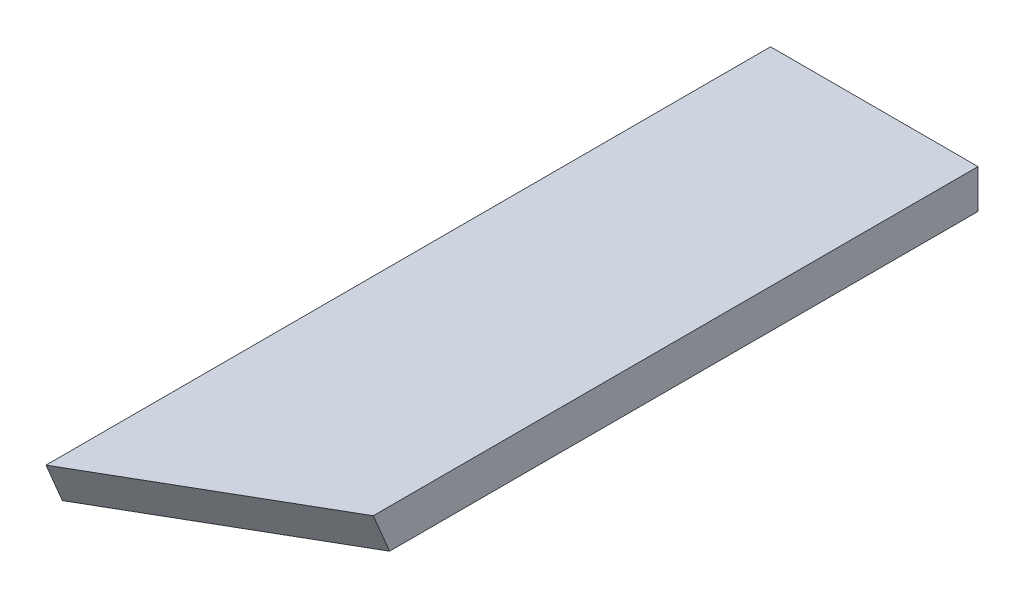
ISO-10303-21;
HEADER;
FILE_DESCRIPTION(('STEP AP214'),'2;1');
FILE_NAME('part.step','',(''),(''),'','','');
FILE_SCHEMA(('AUTOMOTIVE_DESIGN { 1 0 10303 214 1 1 1 1 }'));
ENDSEC;
DATA;
#1=APPLICATION_CONTEXT('core data for automotive mechanical design processes');
#2=APPLICATION_PROTOCOL_DEFINITION('international standard','automotive_design',2000,#1);
#3=PRODUCT_CONTEXT('',#1,'mechanical');
#4=PRODUCT('Part','Part','',(#3));
#5=PRODUCT_RELATED_PRODUCT_CATEGORY('part','',(#4));
#6=PRODUCT_DEFINITION_FORMATION('','',#4);
#7=PRODUCT_DEFINITION_CONTEXT('part definition',#1,'design');
#8=PRODUCT_DEFINITION('design','',#6,#7);
#9=PRODUCT_DEFINITION_SHAPE('','',#8);
#10=(LENGTH_UNIT() NAMED_UNIT(*) SI_UNIT(.MILLI.,.METRE.));
#11=(NAMED_UNIT(*) PLANE_ANGLE_UNIT() SI_UNIT($,.RADIAN.));
#12=(NAMED_UNIT(*) SI_UNIT($,.STERADIAN.) SOLID_ANGLE_UNIT());
#13=UNCERTAINTY_MEASURE_WITH_UNIT(LENGTH_MEASURE(1.E-05),#10,'distance_accuracy_value','');
#14=(GEOMETRIC_REPRESENTATION_CONTEXT(3) GLOBAL_UNCERTAINTY_ASSIGNED_CONTEXT((#13)) GLOBAL_UNIT_ASSIGNED_CONTEXT((#10,
#11,#12)) REPRESENTATION_CONTEXT('',''));
#15=CARTESIAN_POINT('',(0.,0.,0.));
#16=DIRECTION('',(0.,0.,1.));
#17=DIRECTION('',(1.,0.,0.));
#18=AXIS2_PLACEMENT_3D('',#15,#16,#17);
#19=CARTESIAN_POINT('',(-40.,0.,-250.));
#20=DIRECTION('',(0.,-1.,0.));
#21=DIRECTION('',(1.,0.,0.));
#22=AXIS2_PLACEMENT_3D('',#19,#20,#21);
#23=PLANE('',#22);
#24=DIRECTION('',(1.,0.,0.));
#25=VECTOR('',#24,1.);
#26=CARTESIAN_POINT('',(-40.,0.,-250.));
#27=LINE('',#26,#25);
#28=CARTESIAN_POINT('',(-40.,0.,-250.));
#29=VERTEX_POINT('',#28);
#30=CARTESIAN_POINT('',(40.,0.,-250.));
#31=VERTEX_POINT('',#30);
#32=EDGE_CURVE('E11',#29,#31,#27,.T.);
#33=ORIENTED_EDGE('',*,*,#32,.T.);
#34=DIRECTION('',(0.,0.,1.));
#35=VECTOR('',#34,1.);
#36=CARTESIAN_POINT('',(40.,0.,-250.));
#37=LINE('',#36,#35);
#38=CARTESIAN_POINT('',(40.,0.,-23.094010767585));
#39=VERTEX_POINT('',#38);
#40=EDGE_CURVE('E87',#31,#39,#37,.T.);
#41=ORIENTED_EDGE('',*,*,#40,.T.);
#42=DIRECTION('',(0.866025403784439,0.,-0.5));
#43=VECTOR('',#42,1.);
#44=CARTESIAN_POINT('',(-40.,0.,23.094010767585));
#45=LINE('',#44,#43);
#46=CARTESIAN_POINT('',(-40.,0.,23.094010767585));
#47=VERTEX_POINT('',#46);
#48=EDGE_CURVE('E76',#47,#39,#45,.T.);
#49=ORIENTED_EDGE('',*,*,#48,.F.);
#50=DIRECTION('',(0.,0.,1.));
#51=VECTOR('',#50,1.);
#52=CARTESIAN_POINT('',(-40.,0.,-250.));
#53=LINE('',#52,#51);
#54=EDGE_CURVE('E73',#29,#47,#53,.T.);
#55=ORIENTED_EDGE('',*,*,#54,.F.);
#56=EDGE_LOOP('',(#33,#41,#49,#55));
#57=FACE_BOUND('',#56,.T.);
#58=ADVANCED_FACE('F17',(#57),#23,.T.);
#59=CARTESIAN_POINT('',(-44.4618275645654,15.,25.6700481130645));
#60=DIRECTION('',(0.,1.,0.));
#61=DIRECTION('',(0.5,0.,0.866025403784439));
#62=AXIS2_PLACEMENT_3D('',#59,#60,#61);
#63=PLANE('',#62);
#64=DIRECTION('',(1.,0.,0.));
#65=VECTOR('',#64,1.);
#66=CARTESIAN_POINT('',(-40.,14.9999999999998,-250.));
#67=LINE('',#66,#65);
#68=CARTESIAN_POINT('',(-40.,15.,-250.));
#69=VERTEX_POINT('',#68);
#70=CARTESIAN_POINT('',(40.,15.,-250.));
#71=VERTEX_POINT('',#70);
#72=EDGE_CURVE('E24',#69,#71,#67,.T.);
#73=ORIENTED_EDGE('',*,*,#72,.F.);
#74=DIRECTION('',(0.,0.,1.));
#75=VECTOR('',#74,1.);
#76=CARTESIAN_POINT('',(-40.,14.9999999999998,-250.));
#77=LINE('',#76,#75);
#78=CARTESIAN_POINT('',(-40.,15.,29.3981601495031));
#79=VERTEX_POINT('',#78);
#80=EDGE_CURVE('E69',#69,#79,#77,.T.);
#81=ORIENTED_EDGE('',*,*,#80,.T.);
#82=DIRECTION('',(0.866025403784439,0.,-0.5));
#83=VECTOR('',#82,1.);
#84=CARTESIAN_POINT('',(-40.,15.,29.3981601495031));
#85=LINE('',#84,#83);
#86=CARTESIAN_POINT('',(40.,15.,-16.7898613856669));
#87=VERTEX_POINT('',#86);
#88=EDGE_CURVE('E64',#79,#87,#85,.T.);
#89=ORIENTED_EDGE('',*,*,#88,.T.);
#90=DIRECTION('',(0.,0.,1.));
#91=VECTOR('',#90,1.);
#92=CARTESIAN_POINT('',(40.,15.,-250.));
#93=LINE('',#92,#91);
#94=EDGE_CURVE('E55',#71,#87,#93,.T.);
#95=ORIENTED_EDGE('',*,*,#94,.F.);
#96=EDGE_LOOP('',(#73,#81,#89,#95));
#97=FACE_BOUND('',#96,.T.);
#98=ADVANCED_FACE('F67',(#97),#63,.T.);
#99=CARTESIAN_POINT('',(40.,0.,-250.));
#100=DIRECTION('',(1.,0.,0.));
#101=DIRECTION('',(0.,1.,0.));
#102=AXIS2_PLACEMENT_3D('',#99,#100,#101);
#103=PLANE('',#102);
#104=CARTESIAN_POINT('',(40.,7.50000000000078,-549.906235346983));
#105=DIRECTION('',(1.,0.,0.));
#106=DIRECTION('',(0.,0.0249999999999972,0.99968745115661));
#107=AXIS2_PLACEMENT_3D('',#104,#105,#106);
#108=CIRCLE('',#107,300.);
#109=EDGE_CURVE('E62',#71,#31,#108,.T.);
#110=ORIENTED_EDGE('',*,*,#109,.F.);
#111=ORIENTED_EDGE('',*,*,#94,.T.);
#112=DIRECTION('',(0.,-0.921891033043758,-0.387449252410575));
#113=VECTOR('',#112,1.);
#114=CARTESIAN_POINT('',(40.,15.,-16.7898613856669));
#115=LINE('',#114,#113);
#116=EDGE_CURVE('E59',#87,#39,#115,.T.);
#117=ORIENTED_EDGE('',*,*,#116,.T.);
#118=ORIENTED_EDGE('',*,*,#40,.F.);
#119=EDGE_LOOP('',(#110,#111,#117,#118));
#120=FACE_BOUND('',#119,.T.);
#121=ADVANCED_FACE('F57',(#120),#103,.T.);
#122=CARTESIAN_POINT('',(-40.,15.,-250.));
#123=DIRECTION('',(-1.,0.,0.));
#124=DIRECTION('',(0.,-1.,0.));
#125=AXIS2_PLACEMENT_3D('',#122,#123,#124);
#126=PLANE('',#125);
#127=CARTESIAN_POINT('',(-40.,7.50000000000078,-549.906235346983));
#128=DIRECTION('',(1.,0.,0.));
#129=DIRECTION('',(0.,0.0249999999999972,0.99968745115661));
#130=AXIS2_PLACEMENT_3D('',#127,#128,#129);
#131=CIRCLE('',#130,300.);
#132=EDGE_CURVE('E63',#69,#29,#131,.T.);
#133=ORIENTED_EDGE('',*,*,#132,.T.);
#134=ORIENTED_EDGE('',*,*,#54,.T.);
#135=DIRECTION('',(0.,0.921891033043757,0.387449252410578));
#136=VECTOR('',#135,1.);
#137=CARTESIAN_POINT('',(-40.,0.,23.094010767585));
#138=LINE('',#137,#136);
#139=EDGE_CURVE('E77',#47,#79,#138,.T.);
#140=ORIENTED_EDGE('',*,*,#139,.T.);
#141=ORIENTED_EDGE('',*,*,#80,.F.);
#142=EDGE_LOOP('',(#133,#134,#140,#141));
#143=FACE_BOUND('',#142,.T.);
#144=ADVANCED_FACE('F91',(#143),#126,.T.);
#145=CARTESIAN_POINT('',(-40.,7.50000000000078,-549.906235346983));
#146=DIRECTION('',(1.,0.,0.));
#147=DIRECTION('',(0.,0.0249999999999972,0.99968745115661));
#148=AXIS2_PLACEMENT_3D('',#145,#146,#147);
#149=CYLINDRICAL_SURFACE('',#148,300.);
#150=ORIENTED_EDGE('',*,*,#132,.F.);
#151=ORIENTED_EDGE('',*,*,#72,.T.);
#152=ORIENTED_EDGE('',*,*,#109,.T.);
#153=ORIENTED_EDGE('',*,*,#32,.F.);
#154=EDGE_LOOP('',(#150,#151,#152,#153));
#155=FACE_BOUND('',#154,.T.);
#156=ADVANCED_FACE('F89',(#155),#149,.F.);
#157=CARTESIAN_POINT('',(-41.7320508075689,15.,30.3981601495031));
#158=DIRECTION('',(0.469846310392954,-0.342020143325669,0.813797681349374));
#159=DIRECTION('',(-0.171010071662834,-0.939692620785908,-0.296198132726024));
#160=AXIS2_PLACEMENT_3D('',#157,#158,#159);
#161=PLANE('',#160);
#162=ORIENTED_EDGE('',*,*,#48,.T.);
#163=ORIENTED_EDGE('',*,*,#116,.F.);
#164=ORIENTED_EDGE('',*,*,#88,.F.);
#165=ORIENTED_EDGE('',*,*,#139,.F.);
#166=EDGE_LOOP('',(#162,#163,#164,#165));
#167=FACE_BOUND('',#166,.T.);
#168=ADVANCED_FACE('F75',(#167),#161,.T.);
#169=CLOSED_SHELL('',(#58,#98,#121,#144,#156,#168));
#170=MANIFOLD_SOLID_BREP('B1',#169);
#171=ADVANCED_BREP_SHAPE_REPRESENTATION('',(#18,#170),#14);
#172=SHAPE_DEFINITION_REPRESENTATION(#9,#171);
ENDSEC;
END-ISO-10303-21;
